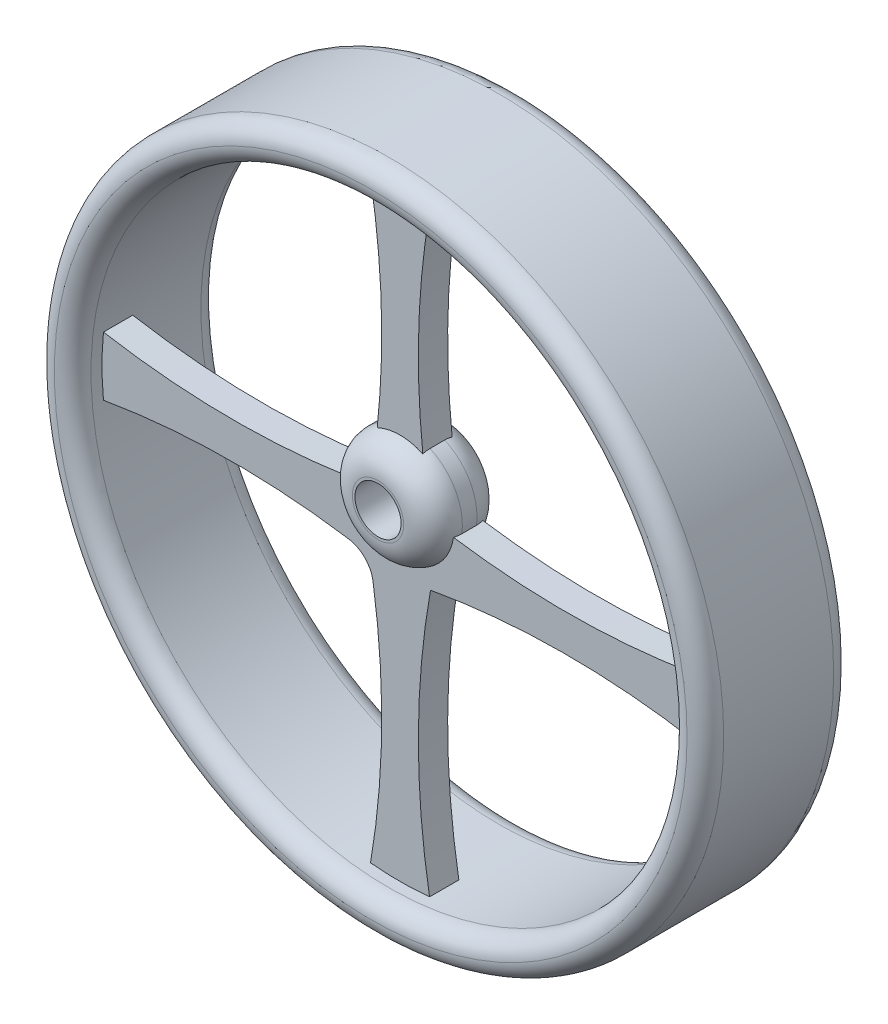
ISO-10303-21;
HEADER;
FILE_DESCRIPTION(('STEP AP214'),'2;1');
FILE_NAME('part.step','',(''),(''),'','','');
FILE_SCHEMA(('AUTOMOTIVE_DESIGN { 1 0 10303 214 1 1 1 1 }'));
ENDSEC;
DATA;
#1=APPLICATION_CONTEXT('core data for automotive mechanical design processes');
#2=APPLICATION_PROTOCOL_DEFINITION('international standard','automotive_design',2000,#1);
#3=PRODUCT_CONTEXT('',#1,'mechanical');
#4=PRODUCT('Part','Part','',(#3));
#5=PRODUCT_RELATED_PRODUCT_CATEGORY('part','',(#4));
#6=PRODUCT_DEFINITION_FORMATION('','',#4);
#7=PRODUCT_DEFINITION_CONTEXT('part definition',#1,'design');
#8=PRODUCT_DEFINITION('design','',#6,#7);
#9=PRODUCT_DEFINITION_SHAPE('','',#8);
#10=(LENGTH_UNIT() NAMED_UNIT(*) SI_UNIT(.MILLI.,.METRE.));
#11=(NAMED_UNIT(*) PLANE_ANGLE_UNIT() SI_UNIT($,.RADIAN.));
#12=(NAMED_UNIT(*) SI_UNIT($,.STERADIAN.) SOLID_ANGLE_UNIT());
#13=UNCERTAINTY_MEASURE_WITH_UNIT(LENGTH_MEASURE(1.E-05),#10,'distance_accuracy_value','');
#14=(GEOMETRIC_REPRESENTATION_CONTEXT(3) GLOBAL_UNCERTAINTY_ASSIGNED_CONTEXT((#13)) GLOBAL_UNIT_ASSIGNED_CONTEXT((#10,
#11,#12)) REPRESENTATION_CONTEXT('',''));
#15=CARTESIAN_POINT('',(0.,0.,0.));
#16=DIRECTION('',(0.,0.,1.));
#17=DIRECTION('',(1.,0.,0.));
#18=AXIS2_PLACEMENT_3D('',#15,#16,#17);
#19=CARTESIAN_POINT('',(0.,3.,3.175));
#20=DIRECTION('',(0.,0.,-1.));
#21=DIRECTION('',(-1.,0.,0.));
#22=AXIS2_PLACEMENT_3D('',#19,#20,#21);
#23=CYLINDRICAL_SURFACE('',#22,4.7625);
#24=DIRECTION('',(0.,0.,-1.));
#25=VECTOR('',#24,1.);
#26=CARTESIAN_POINT('',(4.71107858393852,2.30204238957098,0.));
#27=LINE('',#26,#25);
#28=CARTESIAN_POINT('',(4.71107858393852,2.30204238957098,-0.635));
#29=VERTEX_POINT('',#28);
#30=CARTESIAN_POINT('',(4.71107858393852,2.30204238957098,0.635));
#31=VERTEX_POINT('',#30);
#32=EDGE_CURVE('E269',#29,#31,#27,.F.);
#33=ORIENTED_EDGE('',*,*,#32,.F.);
#34=CARTESIAN_POINT('',(0.,3.,-0.635));
#35=DIRECTION('',(0.,0.,1.));
#36=DIRECTION('',(1.,0.,0.));
#37=AXIS2_PLACEMENT_3D('',#34,#35,#36);
#38=CIRCLE('',#37,4.7625);
#39=CARTESIAN_POINT('',(1.96656615664382,7.337513550589,-0.635));
#40=VERTEX_POINT('',#39);
#41=EDGE_CURVE('E305',#29,#40,#38,.T.);
#42=ORIENTED_EDGE('',*,*,#41,.T.);
#43=DIRECTION('',(0.,0.,-1.));
#44=VECTOR('',#43,1.);
#45=CARTESIAN_POINT('',(1.96656615664382,7.337513550589,0.));
#46=LINE('',#45,#44);
#47=CARTESIAN_POINT('',(1.96656615664382,7.337513550589,0.635));
#48=VERTEX_POINT('',#47);
#49=EDGE_CURVE('E250',#40,#48,#46,.F.);
#50=ORIENTED_EDGE('',*,*,#49,.T.);
#51=CARTESIAN_POINT('',(0.,3.,0.635));
#52=DIRECTION('',(0.,0.,1.));
#53=DIRECTION('',(1.,0.,0.));
#54=AXIS2_PLACEMENT_3D('',#51,#52,#53);
#55=CIRCLE('',#54,4.7625);
#56=EDGE_CURVE('E300',#48,#31,#55,.F.);
#57=ORIENTED_EDGE('',*,*,#56,.T.);
#58=EDGE_LOOP('',(#33,#42,#50,#57));
#59=FACE_BOUND('',#58,.T.);
#60=ADVANCED_FACE('F36',(#59),#23,.T.);
#61=CARTESIAN_POINT('',(0.,0.,-8.89));
#62=DIRECTION('',(0.,0.,1.));
#63=DIRECTION('',(1.,0.,0.));
#64=AXIS2_PLACEMENT_3D('',#61,#62,#63);
#65=CYLINDRICAL_SURFACE('',#64,25.824999992);
#66=CARTESIAN_POINT('',(0.,0.,-7.3025));
#67=DIRECTION('',(0.,0.,1.));
#68=DIRECTION('',(1.,0.,0.));
#69=AXIS2_PLACEMENT_3D('',#66,#67,#68);
#70=CIRCLE('',#69,25.824999992);
#71=CARTESIAN_POINT('',(25.824999992,0.,-7.3025));
#72=VERTEX_POINT('',#71);
#73=EDGE_CURVE('E278',#72,#72,#70,.F.);
#74=ORIENTED_EDGE('',*,*,#73,.T.);
#75=EDGE_LOOP('',(#74));
#76=FACE_BOUND('',#75,.T.);
#77=CARTESIAN_POINT('',(0.,0.,2.2225));
#78=DIRECTION('',(0.,0.,1.));
#79=DIRECTION('',(1.,0.,0.));
#80=AXIS2_PLACEMENT_3D('',#77,#78,#79);
#81=CIRCLE('',#80,25.824999992);
#82=CARTESIAN_POINT('',(25.824999992,0.,2.2225));
#83=VERTEX_POINT('',#82);
#84=EDGE_CURVE('E275',#83,#83,#81,.T.);
#85=ORIENTED_EDGE('',*,*,#84,.T.);
#86=EDGE_LOOP('',(#85));
#87=FACE_BOUND('',#86,.T.);
#88=DIRECTION('',(0.,0.,-1.));
#89=VECTOR('',#88,1.);
#90=CARTESIAN_POINT('',(-2.5562137763234,-25.6981788404652,0.));
#91=LINE('',#90,#89);
#92=CARTESIAN_POINT('',(-2.5562137763234,-25.6981788404652,-1.27));
#93=VERTEX_POINT('',#92);
#94=CARTESIAN_POINT('',(-2.5562137763234,-25.6981788404652,1.27));
#95=VERTEX_POINT('',#94);
#96=EDGE_CURVE('E241',#93,#95,#91,.F.);
#97=ORIENTED_EDGE('',*,*,#96,.F.);
#98=CARTESIAN_POINT('',(0.,0.,-1.27));
#99=DIRECTION('',(0.,0.,-1.));
#100=DIRECTION('',(-1.,0.,0.));
#101=AXIS2_PLACEMENT_3D('',#98,#99,#100);
#102=CIRCLE('',#101,25.824999992);
#103=CARTESIAN_POINT('',(2.5562137763234,-25.6981788404652,-1.27));
#104=VERTEX_POINT('',#103);
#105=EDGE_CURVE('E231',#93,#104,#102,.F.);
#106=ORIENTED_EDGE('',*,*,#105,.T.);
#107=DIRECTION('',(0.,0.,-1.));
#108=VECTOR('',#107,1.);
#109=CARTESIAN_POINT('',(2.5562137763234,-25.6981788404652,0.));
#110=LINE('',#109,#108);
#111=CARTESIAN_POINT('',(2.5562137763234,-25.6981788404652,1.27));
#112=VERTEX_POINT('',#111);
#113=EDGE_CURVE('E179',#112,#104,#110,.T.);
#114=ORIENTED_EDGE('',*,*,#113,.F.);
#115=CARTESIAN_POINT('',(0.,0.,1.27));
#116=DIRECTION('',(0.,0.,-1.));
#117=DIRECTION('',(-1.,0.,0.));
#118=AXIS2_PLACEMENT_3D('',#115,#116,#117);
#119=CIRCLE('',#118,25.824999992);
#120=EDGE_CURVE('E235',#95,#112,#119,.F.);
#121=ORIENTED_EDGE('',*,*,#120,.F.);
#122=EDGE_LOOP('',(#97,#106,#114,#121));
#123=FACE_BOUND('',#122,.T.);
#124=CARTESIAN_POINT('',(0.,0.,1.27));
#125=DIRECTION('',(0.,0.,-1.));
#126=DIRECTION('',(-1.,0.,0.));
#127=AXIS2_PLACEMENT_3D('',#124,#125,#126);
#128=CIRCLE('',#127,25.824999992);
#129=CARTESIAN_POINT('',(2.5562137763234,25.6981788404652,1.27));
#130=VERTEX_POINT('',#129);
#131=CARTESIAN_POINT('',(-2.5562137763234,25.6981788404652,1.27));
#132=VERTEX_POINT('',#131);
#133=EDGE_CURVE('E267',#130,#132,#128,.F.);
#134=ORIENTED_EDGE('',*,*,#133,.F.);
#135=DIRECTION('',(0.,0.,-1.));
#136=VECTOR('',#135,1.);
#137=CARTESIAN_POINT('',(2.5562137763234,25.6981788404652,0.));
#138=LINE('',#137,#136);
#139=CARTESIAN_POINT('',(2.5562137763234,25.6981788404652,-1.27));
#140=VERTEX_POINT('',#139);
#141=EDGE_CURVE('E265',#140,#130,#138,.F.);
#142=ORIENTED_EDGE('',*,*,#141,.F.);
#143=CARTESIAN_POINT('',(0.,0.,-1.27));
#144=DIRECTION('',(0.,0.,-1.));
#145=DIRECTION('',(-1.,0.,0.));
#146=AXIS2_PLACEMENT_3D('',#143,#144,#145);
#147=CIRCLE('',#146,25.824999992);
#148=CARTESIAN_POINT('',(-2.5562137763234,25.6981788404652,-1.27));
#149=VERTEX_POINT('',#148);
#150=EDGE_CURVE('E257',#140,#149,#147,.F.);
#151=ORIENTED_EDGE('',*,*,#150,.T.);
#152=DIRECTION('',(0.,0.,-1.));
#153=VECTOR('',#152,1.);
#154=CARTESIAN_POINT('',(-2.5562137763234,25.6981788404652,0.));
#155=LINE('',#154,#153);
#156=EDGE_CURVE('E262',#132,#149,#155,.T.);
#157=ORIENTED_EDGE('',*,*,#156,.F.);
#158=EDGE_LOOP('',(#134,#142,#151,#157));
#159=FACE_BOUND('',#158,.T.);
#160=DIRECTION('',(0.,0.,-1.));
#161=VECTOR('',#160,1.);
#162=CARTESIAN_POINT('',(25.6981788404652,-2.55621377632312,0.));
#163=LINE('',#162,#161);
#164=CARTESIAN_POINT('',(25.6981788404652,-2.55621377632313,-1.27));
#165=VERTEX_POINT('',#164);
#166=CARTESIAN_POINT('',(25.6981788404652,-2.55621377632313,1.27));
#167=VERTEX_POINT('',#166);
#168=EDGE_CURVE('E238',#165,#167,#163,.F.);
#169=ORIENTED_EDGE('',*,*,#168,.F.);
#170=CARTESIAN_POINT('',(25.6981788404652,2.55621377632367,-1.27));
#171=VERTEX_POINT('',#170);
#172=EDGE_CURVE('E198',#165,#171,#102,.F.);
#173=ORIENTED_EDGE('',*,*,#172,.T.);
#174=DIRECTION('',(0.,0.,-1.));
#175=VECTOR('',#174,1.);
#176=CARTESIAN_POINT('',(25.6981788404652,2.55621377632367,0.));
#177=LINE('',#176,#175);
#178=CARTESIAN_POINT('',(25.6981788404652,2.55621377632367,1.27));
#179=VERTEX_POINT('',#178);
#180=EDGE_CURVE('E221',#179,#171,#177,.T.);
#181=ORIENTED_EDGE('',*,*,#180,.F.);
#182=EDGE_CURVE('E234',#167,#179,#119,.F.);
#183=ORIENTED_EDGE('',*,*,#182,.F.);
#184=EDGE_LOOP('',(#169,#173,#181,#183));
#185=FACE_BOUND('',#184,.T.);
#186=CARTESIAN_POINT('',(-25.6981788404652,2.5562137763233,1.27));
#187=VERTEX_POINT('',#186);
#188=CARTESIAN_POINT('',(-25.6981788404652,-2.55621377632349,1.27));
#189=VERTEX_POINT('',#188);
#190=EDGE_CURVE('E232',#187,#189,#119,.F.);
#191=ORIENTED_EDGE('',*,*,#190,.F.);
#192=DIRECTION('',(0.,0.,-1.));
#193=VECTOR('',#192,1.);
#194=CARTESIAN_POINT('',(-25.6981788404652,2.5562137763233,0.));
#195=LINE('',#194,#193);
#196=CARTESIAN_POINT('',(-25.6981788404652,2.5562137763233,-1.27));
#197=VERTEX_POINT('',#196);
#198=EDGE_CURVE('E236',#197,#187,#195,.F.);
#199=ORIENTED_EDGE('',*,*,#198,.F.);
#200=CARTESIAN_POINT('',(-25.6981788404652,-2.55621377632349,-1.27));
#201=VERTEX_POINT('',#200);
#202=EDGE_CURVE('E228',#197,#201,#102,.F.);
#203=ORIENTED_EDGE('',*,*,#202,.T.);
#204=DIRECTION('',(0.,0.,-1.));
#205=VECTOR('',#204,1.);
#206=CARTESIAN_POINT('',(-25.6981788404652,-2.55621377632349,0.));
#207=LINE('',#206,#205);
#208=EDGE_CURVE('E244',#189,#201,#207,.T.);
#209=ORIENTED_EDGE('',*,*,#208,.F.);
#210=EDGE_LOOP('',(#191,#199,#203,#209));
#211=FACE_BOUND('',#210,.T.);
#212=ADVANCED_FACE('F400',(#76,#87,#123,#159,#185,#211),#65,.F.);
#213=DIRECTION('',(0.,0.,-1.));
#214=VECTOR('',#213,1.);
#215=CARTESIAN_POINT('',(-1.96656615664382,7.33751355058899,0.));
#216=LINE('',#215,#214);
#217=CARTESIAN_POINT('',(-1.96656615664382,7.33751355058899,0.635));
#218=VERTEX_POINT('',#217);
#219=CARTESIAN_POINT('',(-1.96656615664382,7.33751355058899,-0.635));
#220=VERTEX_POINT('',#219);
#221=EDGE_CURVE('E247',#218,#220,#216,.T.);
#222=ORIENTED_EDGE('',*,*,#221,.T.);
#223=CARTESIAN_POINT('',(0.,3.,-0.635));
#224=DIRECTION('',(0.,0.,1.));
#225=DIRECTION('',(1.,0.,0.));
#226=AXIS2_PLACEMENT_3D('',#223,#224,#225);
#227=CIRCLE('',#226,4.7625);
#228=CARTESIAN_POINT('',(-4.71107858393851,2.30204238957091,-0.635));
#229=VERTEX_POINT('',#228);
#230=EDGE_CURVE('E303',#220,#229,#227,.T.);
#231=ORIENTED_EDGE('',*,*,#230,.T.);
#232=DIRECTION('',(0.,0.,-1.));
#233=VECTOR('',#232,1.);
#234=CARTESIAN_POINT('',(-4.71107858393851,2.30204238957091,0.));
#235=LINE('',#234,#233);
#236=CARTESIAN_POINT('',(-4.71107858393851,2.30204238957091,0.635));
#237=VERTEX_POINT('',#236);
#238=EDGE_CURVE('E272',#237,#229,#235,.T.);
#239=ORIENTED_EDGE('',*,*,#238,.F.);
#240=CARTESIAN_POINT('',(0.,3.,0.635));
#241=DIRECTION('',(0.,0.,1.));
#242=DIRECTION('',(1.,0.,0.));
#243=AXIS2_PLACEMENT_3D('',#240,#241,#242);
#244=CIRCLE('',#243,4.7625);
#245=EDGE_CURVE('E298',#237,#218,#244,.F.);
#246=ORIENTED_EDGE('',*,*,#245,.T.);
#247=EDGE_LOOP('',(#222,#231,#239,#246));
#248=FACE_BOUND('',#247,.T.);
#249=ADVANCED_FACE('F398',(#248),#23,.T.);
#250=CARTESIAN_POINT('',(67.8079724044094,14.4128360718493,1.27));
#251=DIRECTION('',(0.,0.,-1.));
#252=DIRECTION('',(-1.,0.,0.));
#253=AXIS2_PLACEMENT_3D('',#250,#251,#252);
#254=CYLINDRICAL_SURFACE('',#253,66.2204724044094);
#255=ORIENTED_EDGE('',*,*,#49,.F.);
#256=CARTESIAN_POINT('',(1.96656615664382,7.337513550589,-0.635));
#257=CARTESIAN_POINT('',(1.96656604131507,7.33752103080129,-0.688836671156674));
#258=CARTESIAN_POINT('',(1.96677841304455,7.33553987882745,-0.742661949557122));
#259=CARTESIAN_POINT('',(1.96762484897395,7.32766505895606,-0.849733116260245));
#260=CARTESIAN_POINT('',(1.96825665308089,7.32179236079308,-0.902980563668016));
#261=CARTESIAN_POINT('',(1.97078310963382,7.29836984310736,-1.06210365472474));
#262=CARTESIAN_POINT('',(1.97330879305827,7.27501596953603,-1.16714274710446));
#263=CARTESIAN_POINT('',(1.97667071605037,7.24410651359392,-1.27));
#264=B_SPLINE_CURVE_WITH_KNOTS('',3,(#256,#257,#258,#259,#260,#261,#262,#263),.UNSPECIFIED.,.F.,
.F.,(4,2,2,4),(0.,0.161450883355719,0.322038781475506,0.643859831909047),.UNSPECIFIED.);
#265=CARTESIAN_POINT('',(1.97667071605036,7.24410651359393,-1.27));
#266=VERTEX_POINT('',#265);
#267=EDGE_CURVE('E318',#40,#266,#264,.T.);
#268=ORIENTED_EDGE('',*,*,#267,.T.);
#269=CARTESIAN_POINT('',(67.8079724044094,14.4128360718493,-1.27));
#270=DIRECTION('',(0.,0.,-1.));
#271=DIRECTION('',(-1.,0.,0.));
#272=AXIS2_PLACEMENT_3D('',#269,#270,#271);
#273=CIRCLE('',#272,66.2204724044094);
#274=EDGE_CURVE('E253',#266,#140,#273,.T.);
#275=ORIENTED_EDGE('',*,*,#274,.T.);
#276=ORIENTED_EDGE('',*,*,#141,.T.);
#277=CARTESIAN_POINT('',(67.8079724044094,14.4128360718493,1.27));
#278=DIRECTION('',(0.,0.,-1.));
#279=DIRECTION('',(-1.,0.,0.));
#280=AXIS2_PLACEMENT_3D('',#277,#278,#279);
#281=CIRCLE('',#280,66.2204724044094);
#282=CARTESIAN_POINT('',(1.97667071605036,7.24410651359392,1.27));
#283=VERTEX_POINT('',#282);
#284=EDGE_CURVE('E56',#283,#130,#281,.T.);
#285=ORIENTED_EDGE('',*,*,#284,.F.);
#286=CARTESIAN_POINT('',(1.97667071605036,7.24410651359392,1.27));
#287=CARTESIAN_POINT('',(1.97330879305831,7.27501596953601,1.16714274710446));
#288=CARTESIAN_POINT('',(1.97078310963384,7.29836984310735,1.06210365472473));
#289=CARTESIAN_POINT('',(1.96825665308089,7.32179236079308,0.902980563668011));
#290=CARTESIAN_POINT('',(1.96762484897395,7.32766505895606,0.849733116260239));
#291=CARTESIAN_POINT('',(1.96677841304457,7.33553987882744,0.742661949557113));
#292=CARTESIAN_POINT('',(1.96656604131511,7.33752103080128,0.688836671156663));
#293=CARTESIAN_POINT('',(1.9665661566439,7.33751355058896,0.634999999999986));
#294=B_SPLINE_CURVE_WITH_KNOTS('',3,(#286,#287,#288,#289,#290,#291,#292,#293),.UNSPECIFIED.,.F.,
.F.,(4,2,2,4),(0.,0.321821050433543,0.482408948553334,0.643859831909057),.UNSPECIFIED.);
#295=EDGE_CURVE('E11',#283,#48,#294,.T.);
#296=ORIENTED_EDGE('',*,*,#295,.T.);
#297=EDGE_LOOP('',(#255,#268,#275,#276,#285,#296));
#298=FACE_BOUND('',#297,.T.);
#299=ADVANCED_FACE('F327',(#298),#254,.F.);
#300=CARTESIAN_POINT('',(-67.8079724044094,14.4128360718493,1.27));
#301=DIRECTION('',(0.,0.,-1.));
#302=DIRECTION('',(-1.,0.,0.));
#303=AXIS2_PLACEMENT_3D('',#300,#301,#302);
#304=CYLINDRICAL_SURFACE('',#303,66.2204724044094);
#305=ORIENTED_EDGE('',*,*,#221,.F.);
#306=CARTESIAN_POINT('',(-1.96656615664382,7.33751355058899,0.635));
#307=CARTESIAN_POINT('',(-1.96656604131508,7.33752103080129,0.688836671156673));
#308=CARTESIAN_POINT('',(-1.96677841304456,7.33553987882745,0.742661949557121));
#309=CARTESIAN_POINT('',(-1.96762484897395,7.32766505895606,0.849733116260245));
#310=CARTESIAN_POINT('',(-1.96825665308088,7.32179236079308,0.902980563668017));
#311=CARTESIAN_POINT('',(-1.97078310963378,7.29836984310738,1.06210365472474));
#312=CARTESIAN_POINT('',(-1.97330879305822,7.27501596953605,1.16714274710446));
#313=CARTESIAN_POINT('',(-1.97667071605035,7.24410651359393,1.27));
#314=B_SPLINE_CURVE_WITH_KNOTS('',3,(#306,#307,#308,#309,#310,#311,#312,#313),.UNSPECIFIED.,.F.,
.F.,(4,2,2,4),(0.,0.161450883355719,0.322038781475506,0.643859831909047),.UNSPECIFIED.);
#315=CARTESIAN_POINT('',(-1.97667071605036,7.24410651359392,1.27));
#316=VERTEX_POINT('',#315);
#317=EDGE_CURVE('E377',#218,#316,#314,.T.);
#318=ORIENTED_EDGE('',*,*,#317,.T.);
#319=CARTESIAN_POINT('',(-67.8079724044094,14.4128360718493,1.27));
#320=DIRECTION('',(0.,0.,-1.));
#321=DIRECTION('',(-1.,0.,0.));
#322=AXIS2_PLACEMENT_3D('',#319,#320,#321);
#323=CIRCLE('',#322,66.2204724044094);
#324=EDGE_CURVE('E63',#132,#316,#323,.T.);
#325=ORIENTED_EDGE('',*,*,#324,.F.);
#326=ORIENTED_EDGE('',*,*,#156,.T.);
#327=CARTESIAN_POINT('',(-67.8079724044094,14.4128360718493,-1.27));
#328=DIRECTION('',(0.,0.,-1.));
#329=DIRECTION('',(-1.,0.,0.));
#330=AXIS2_PLACEMENT_3D('',#327,#328,#329);
#331=CIRCLE('',#330,66.2204724044094);
#332=CARTESIAN_POINT('',(-1.97667071605036,7.24410651359392,-1.27));
#333=VERTEX_POINT('',#332);
#334=EDGE_CURVE('E255',#149,#333,#331,.T.);
#335=ORIENTED_EDGE('',*,*,#334,.T.);
#336=CARTESIAN_POINT('',(-1.97667071605036,7.24410651359392,-1.27));
#337=CARTESIAN_POINT('',(-1.97330879305827,7.27501596953603,-1.16714274710446));
#338=CARTESIAN_POINT('',(-1.97078310963381,7.29836984310736,-1.06210365472474));
#339=CARTESIAN_POINT('',(-1.96825665308088,7.32179236079308,-0.902980563668013));
#340=CARTESIAN_POINT('',(-1.96762484897394,7.32766505895606,-0.849733116260241));
#341=CARTESIAN_POINT('',(-1.96677841304457,7.33553987882745,-0.742661949557115));
#342=CARTESIAN_POINT('',(-1.96656604131511,7.33752103080128,-0.688836671156665));
#343=CARTESIAN_POINT('',(-1.96656615664389,7.33751355058896,-0.634999999999989));
#344=B_SPLINE_CURVE_WITH_KNOTS('',3,(#336,#337,#338,#339,#340,#341,#342,#343),.UNSPECIFIED.,.F.,
.F.,(4,2,2,4),(0.,0.321821050433544,0.482408948553334,0.643859831909057),.UNSPECIFIED.);
#345=EDGE_CURVE('E342',#333,#220,#344,.T.);
#346=ORIENTED_EDGE('',*,*,#345,.T.);
#347=EDGE_LOOP('',(#305,#318,#325,#326,#335,#346));
#348=FACE_BOUND('',#347,.T.);
#349=ADVANCED_FACE('F384',(#348),#304,.F.);
#350=CARTESIAN_POINT('',(0.,0.,-8.89));
#351=DIRECTION('',(0.,0.,1.));
#352=DIRECTION('',(1.,0.,0.));
#353=AXIS2_PLACEMENT_3D('',#350,#351,#352);
#354=CYLINDRICAL_SURFACE('',#353,28.999999992);
#355=CARTESIAN_POINT('',(0.,0.,-7.3025));
#356=DIRECTION('',(0.,0.,1.));
#357=DIRECTION('',(1.,0.,0.));
#358=AXIS2_PLACEMENT_3D('',#355,#356,#357);
#359=CIRCLE('',#358,28.999999992);
#360=CARTESIAN_POINT('',(28.999999992,0.,-7.3025));
#361=VERTEX_POINT('',#360);
#362=EDGE_CURVE('E284',#361,#361,#359,.T.);
#363=ORIENTED_EDGE('',*,*,#362,.T.);
#364=EDGE_LOOP('',(#363));
#365=FACE_BOUND('',#364,.T.);
#366=CARTESIAN_POINT('',(0.,0.,2.2225));
#367=DIRECTION('',(0.,0.,1.));
#368=DIRECTION('',(1.,0.,0.));
#369=AXIS2_PLACEMENT_3D('',#366,#367,#368);
#370=CIRCLE('',#369,28.999999992);
#371=CARTESIAN_POINT('',(28.999999992,0.,2.2225));
#372=VERTEX_POINT('',#371);
#373=EDGE_CURVE('E281',#372,#372,#370,.F.);
#374=ORIENTED_EDGE('',*,*,#373,.T.);
#375=EDGE_LOOP('',(#374));
#376=FACE_BOUND('',#375,.T.);
#377=ADVANCED_FACE('F388',(#365,#376),#354,.T.);
#378=CARTESIAN_POINT('',(67.8079724044094,14.4128360718493,1.27));
#379=DIRECTION('',(0.,0.,-1.));
#380=DIRECTION('',(-1.,0.,0.));
#381=AXIS2_PLACEMENT_3D('',#378,#379,#380);
#382=PLANE('',#381);
#383=ORIENTED_EDGE('',*,*,#324,.T.);
#384=CARTESIAN_POINT('',(0.,3.,1.27));
#385=DIRECTION('',(0.,0.,1.));
#386=DIRECTION('',(1.,0.,0.));
#387=AXIS2_PLACEMENT_3D('',#384,#385,#386);
#388=CIRCLE('',#387,4.68184442484171);
#389=EDGE_CURVE('E50',#316,#283,#388,.F.);
#390=ORIENTED_EDGE('',*,*,#389,.T.);
#391=ORIENTED_EDGE('',*,*,#284,.T.);
#392=ORIENTED_EDGE('',*,*,#133,.T.);
#393=EDGE_LOOP('',(#383,#390,#391,#392));
#394=FACE_BOUND('',#393,.T.);
#395=ADVANCED_FACE('F394',(#394),#382,.F.);
#396=CARTESIAN_POINT('',(67.8079724044094,14.4128360718493,-1.27));
#397=DIRECTION('',(0.,0.,-1.));
#398=DIRECTION('',(-1.,0.,0.));
#399=AXIS2_PLACEMENT_3D('',#396,#397,#398);
#400=PLANE('',#399);
#401=ORIENTED_EDGE('',*,*,#274,.F.);
#402=CARTESIAN_POINT('',(0.,3.,-1.27));
#403=DIRECTION('',(0.,0.,1.));
#404=DIRECTION('',(1.,0.,0.));
#405=AXIS2_PLACEMENT_3D('',#402,#403,#404);
#406=CIRCLE('',#405,4.68184442484171);
#407=EDGE_CURVE('E325',#266,#333,#406,.T.);
#408=ORIENTED_EDGE('',*,*,#407,.T.);
#409=ORIENTED_EDGE('',*,*,#334,.F.);
#410=ORIENTED_EDGE('',*,*,#150,.F.);
#411=EDGE_LOOP('',(#401,#408,#409,#410));
#412=FACE_BOUND('',#411,.T.);
#413=ADVANCED_FACE('F390',(#412),#400,.T.);
#414=CARTESIAN_POINT('',(0.,3.,3.175));
#415=DIRECTION('',(0.,0.,1.));
#416=DIRECTION('',(1.,0.,0.));
#417=AXIS2_PLACEMENT_3D('',#414,#415,#416);
#418=PLANE('',#417);
#419=CARTESIAN_POINT('',(0.,3.,3.175));
#420=DIRECTION('',(0.,0.,1.));
#421=DIRECTION('',(1.,0.,0.));
#422=AXIS2_PLACEMENT_3D('',#419,#420,#421);
#423=CIRCLE('',#422,2.2225);
#424=CARTESIAN_POINT('',(2.2225,3.,3.175));
#425=VERTEX_POINT('',#424);
#426=EDGE_CURVE('E311',#425,#425,#423,.T.);
#427=ORIENTED_EDGE('',*,*,#426,.T.);
#428=EDGE_LOOP('',(#427));
#429=FACE_BOUND('',#428,.T.);
#430=CARTESIAN_POINT('',(0.,3.,3.175));
#431=DIRECTION('',(0.,0.,1.));
#432=DIRECTION('',(1.,0.,0.));
#433=AXIS2_PLACEMENT_3D('',#430,#431,#432);
#434=CIRCLE('',#433,2.);
#435=CARTESIAN_POINT('',(2.,3.,3.175));
#436=VERTEX_POINT('',#435);
#437=EDGE_CURVE('E204',#436,#436,#434,.T.);
#438=ORIENTED_EDGE('',*,*,#437,.F.);
#439=EDGE_LOOP('',(#438));
#440=FACE_BOUND('',#439,.T.);
#441=ADVANCED_FACE('F366',(#429,#440),#418,.T.);
#442=CARTESIAN_POINT('',(0.,3.,-3.175));
#443=DIRECTION('',(0.,0.,1.));
#444=DIRECTION('',(1.,0.,0.));
#445=AXIS2_PLACEMENT_3D('',#442,#443,#444);
#446=PLANE('',#445);
#447=CARTESIAN_POINT('',(0.,3.,-3.175));
#448=DIRECTION('',(0.,0.,1.));
#449=DIRECTION('',(1.,0.,0.));
#450=AXIS2_PLACEMENT_3D('',#447,#448,#449);
#451=CIRCLE('',#450,2.2225);
#452=CARTESIAN_POINT('',(2.2225,3.,-3.175));
#453=VERTEX_POINT('',#452);
#454=EDGE_CURVE('E308',#453,#453,#451,.F.);
#455=ORIENTED_EDGE('',*,*,#454,.T.);
#456=EDGE_LOOP('',(#455));
#457=FACE_BOUND('',#456,.T.);
#458=CARTESIAN_POINT('',(0.,3.,-3.175));
#459=DIRECTION('',(0.,0.,1.));
#460=DIRECTION('',(1.,0.,0.));
#461=AXIS2_PLACEMENT_3D('',#458,#459,#460);
#462=CIRCLE('',#461,2.);
#463=CARTESIAN_POINT('',(2.,3.,-3.175));
#464=VERTEX_POINT('',#463);
#465=EDGE_CURVE('E200',#464,#464,#462,.T.);
#466=ORIENTED_EDGE('',*,*,#465,.T.);
#467=EDGE_LOOP('',(#466));
#468=FACE_BOUND('',#467,.T.);
#469=ADVANCED_FACE('F402',(#457,#468),#446,.F.);
#470=CARTESIAN_POINT('',(-14.412836071849,-67.8079724044095,1.27));
#471=DIRECTION('',(0.,0.,-1.));
#472=DIRECTION('',(-1.,0.,0.));
#473=AXIS2_PLACEMENT_3D('',#470,#471,#472);
#474=CYLINDRICAL_SURFACE('',#473,66.2204724044094);
#475=CARTESIAN_POINT('',(-14.412836071849,-67.8079724044095,-1.27));
#476=DIRECTION('',(0.,0.,-1.));
#477=DIRECTION('',(0.,-1.,0.));
#478=AXIS2_PLACEMENT_3D('',#475,#476,#477);
#479=CIRCLE('',#478,66.2204724044094);
#480=CARTESIAN_POINT('',(-4.46822330042555,-2.3384707850326,-1.27));
#481=VERTEX_POINT('',#480);
#482=EDGE_CURVE('E218',#201,#481,#479,.T.);
#483=ORIENTED_EDGE('',*,*,#482,.T.);
#484=DIRECTION('',(0.,0.,-1.));
#485=VECTOR('',#484,1.);
#486=CARTESIAN_POINT('',(-4.46822330042555,-2.33847078503259,1.27));
#487=LINE('',#486,#485);
#488=CARTESIAN_POINT('',(-4.46822330042555,-2.3384707850326,1.27));
#489=VERTEX_POINT('',#488);
#490=EDGE_CURVE('E296',#481,#489,#487,.F.);
#491=ORIENTED_EDGE('',*,*,#490,.T.);
#492=CARTESIAN_POINT('',(-14.412836071849,-67.8079724044095,1.27));
#493=DIRECTION('',(0.,0.,-1.));
#494=DIRECTION('',(0.,-1.,0.));
#495=AXIS2_PLACEMENT_3D('',#492,#493,#494);
#496=CIRCLE('',#495,66.2204724044094);
#497=EDGE_CURVE('E217',#189,#489,#496,.T.);
#498=ORIENTED_EDGE('',*,*,#497,.F.);
#499=ORIENTED_EDGE('',*,*,#208,.T.);
#500=EDGE_LOOP('',(#483,#491,#498,#499));
#501=FACE_BOUND('',#500,.T.);
#502=ADVANCED_FACE('F364',(#501),#474,.F.);
#503=CARTESIAN_POINT('',(-67.8079724044094,-14.4128360718493,1.27));
#504=DIRECTION('',(0.,0.,-1.));
#505=DIRECTION('',(-1.,0.,0.));
#506=AXIS2_PLACEMENT_3D('',#503,#504,#505);
#507=CYLINDRICAL_SURFACE('',#506,66.2204724044094);
#508=CARTESIAN_POINT('',(-67.8079724044094,-14.4128360718493,1.27));
#509=DIRECTION('',(0.,0.,-1.));
#510=DIRECTION('',(1.,0.,0.));
#511=AXIS2_PLACEMENT_3D('',#508,#509,#510);
#512=CIRCLE('',#511,66.2204724044094);
#513=CARTESIAN_POINT('',(-2.33847078503258,-4.46822330042556,1.27));
#514=VERTEX_POINT('',#513);
#515=EDGE_CURVE('E183',#514,#95,#512,.T.);
#516=ORIENTED_EDGE('',*,*,#515,.F.);
#517=DIRECTION('',(0.,0.,-1.));
#518=VECTOR('',#517,1.);
#519=CARTESIAN_POINT('',(-2.33847078503258,-4.46822330042557,1.27));
#520=LINE('',#519,#518);
#521=CARTESIAN_POINT('',(-2.33847078503258,-4.46822330042556,-1.27));
#522=VERTEX_POINT('',#521);
#523=EDGE_CURVE('E287',#514,#522,#520,.T.);
#524=ORIENTED_EDGE('',*,*,#523,.T.);
#525=CARTESIAN_POINT('',(-67.8079724044094,-14.4128360718493,-1.27));
#526=DIRECTION('',(0.,0.,-1.));
#527=DIRECTION('',(1.,0.,0.));
#528=AXIS2_PLACEMENT_3D('',#525,#526,#527);
#529=CIRCLE('',#528,66.2204724044094);
#530=EDGE_CURVE('E184',#522,#93,#529,.T.);
#531=ORIENTED_EDGE('',*,*,#530,.T.);
#532=ORIENTED_EDGE('',*,*,#96,.T.);
#533=EDGE_LOOP('',(#516,#524,#531,#532));
#534=FACE_BOUND('',#533,.T.);
#535=ADVANCED_FACE('F409',(#534),#507,.F.);
#536=CARTESIAN_POINT('',(67.8079724044094,-14.4128360718493,1.27));
#537=DIRECTION('',(0.,0.,-1.));
#538=DIRECTION('',(-1.,0.,0.));
#539=AXIS2_PLACEMENT_3D('',#536,#537,#538);
#540=CYLINDRICAL_SURFACE('',#539,66.2204724044094);
#541=CARTESIAN_POINT('',(67.8079724044094,-14.4128360718493,1.27));
#542=DIRECTION('',(0.,0.,-1.));
#543=DIRECTION('',(1.,0.,0.));
#544=AXIS2_PLACEMENT_3D('',#541,#542,#543);
#545=CIRCLE('',#544,66.2204724044094);
#546=CARTESIAN_POINT('',(2.64203623611498,-2.64203623611494,1.27));
#547=VERTEX_POINT('',#546);
#548=EDGE_CURVE('E210',#112,#547,#545,.T.);
#549=ORIENTED_EDGE('',*,*,#548,.F.);
#550=ORIENTED_EDGE('',*,*,#113,.T.);
#551=CARTESIAN_POINT('',(67.8079724044094,-14.4128360718493,-1.27));
#552=DIRECTION('',(0.,0.,-1.));
#553=DIRECTION('',(1.,0.,0.));
#554=AXIS2_PLACEMENT_3D('',#551,#552,#553);
#555=CIRCLE('',#554,66.2204724044094);
#556=CARTESIAN_POINT('',(2.64203623611498,-2.64203623611494,-1.27));
#557=VERTEX_POINT('',#556);
#558=EDGE_CURVE('E173',#104,#557,#555,.T.);
#559=ORIENTED_EDGE('',*,*,#558,.T.);
#560=DIRECTION('',(0.,0.,-1.));
#561=VECTOR('',#560,1.);
#562=CARTESIAN_POINT('',(2.64203623611498,-2.64203623611493,0.));
#563=LINE('',#562,#561);
#564=EDGE_CURVE('E177',#547,#557,#563,.T.);
#565=ORIENTED_EDGE('',*,*,#564,.F.);
#566=EDGE_LOOP('',(#549,#550,#559,#565));
#567=FACE_BOUND('',#566,.T.);
#568=ADVANCED_FACE('F176',(#567),#540,.F.);
#569=CARTESIAN_POINT('',(14.41283607185,-67.8079724044093,1.27));
#570=DIRECTION('',(0.,0.,-1.));
#571=DIRECTION('',(-1.,0.,0.));
#572=AXIS2_PLACEMENT_3D('',#569,#570,#571);
#573=CYLINDRICAL_SURFACE('',#572,66.2204724044094);
#574=CARTESIAN_POINT('',(14.41283607185,-67.8079724044093,-1.27));
#575=DIRECTION('',(0.,0.,-1.));
#576=DIRECTION('',(0.,1.,0.));
#577=AXIS2_PLACEMENT_3D('',#574,#575,#576);
#578=CIRCLE('',#577,66.2204724044094);
#579=EDGE_CURVE('E190',#557,#165,#578,.T.);
#580=ORIENTED_EDGE('',*,*,#579,.T.);
#581=ORIENTED_EDGE('',*,*,#168,.T.);
#582=CARTESIAN_POINT('',(14.41283607185,-67.8079724044093,1.27));
#583=DIRECTION('',(0.,0.,-1.));
#584=DIRECTION('',(0.,1.,0.));
#585=AXIS2_PLACEMENT_3D('',#582,#583,#584);
#586=CIRCLE('',#585,66.2204724044094);
#587=EDGE_CURVE('E192',#547,#167,#586,.T.);
#588=ORIENTED_EDGE('',*,*,#587,.F.);
#589=ORIENTED_EDGE('',*,*,#564,.T.);
#590=EDGE_LOOP('',(#580,#581,#588,#589));
#591=FACE_BOUND('',#590,.T.);
#592=ADVANCED_FACE('F188',(#591),#573,.F.);
#593=CARTESIAN_POINT('',(-14.4128360718495,67.8079724044093,1.27));
#594=DIRECTION('',(0.,0.,-1.));
#595=DIRECTION('',(-1.,0.,0.));
#596=AXIS2_PLACEMENT_3D('',#593,#594,#595);
#597=CYLINDRICAL_SURFACE('',#596,66.2204724044094);
#598=CARTESIAN_POINT('',(-14.4128360718495,67.8079724044093,-1.27));
#599=DIRECTION('',(0.,0.,-1.));
#600=DIRECTION('',(0.,-1.,0.));
#601=AXIS2_PLACEMENT_3D('',#598,#599,#600);
#602=CIRCLE('',#601,66.2204724044094);
#603=CARTESIAN_POINT('',(-4.63130050922474,2.31390757789049,-1.27));
#604=VERTEX_POINT('',#603);
#605=EDGE_CURVE('E212',#604,#197,#602,.T.);
#606=ORIENTED_EDGE('',*,*,#605,.T.);
#607=ORIENTED_EDGE('',*,*,#198,.T.);
#608=CARTESIAN_POINT('',(-14.4128360718495,67.8079724044093,1.27));
#609=DIRECTION('',(0.,0.,-1.));
#610=DIRECTION('',(0.,-1.,0.));
#611=AXIS2_PLACEMENT_3D('',#608,#609,#610);
#612=CIRCLE('',#611,66.2204724044094);
#613=CARTESIAN_POINT('',(-4.63130050922474,2.31390757789049,1.27));
#614=VERTEX_POINT('',#613);
#615=EDGE_CURVE('E214',#614,#187,#612,.T.);
#616=ORIENTED_EDGE('',*,*,#615,.F.);
#617=CARTESIAN_POINT('',(-4.63130050922474,2.31390757789048,1.27));
#618=CARTESIAN_POINT('',(-4.65783909852795,2.30995433771547,1.16586726961863));
#619=CARTESIAN_POINT('',(-4.67775656607236,2.30698895193466,1.06088423778076));
#620=CARTESIAN_POINT('',(-4.70434925765321,2.30303388916004,0.849217571115326));
#621=CARTESIAN_POINT('',(-4.71102448168006,2.30204421216766,0.742533936286532));
#622=CARTESIAN_POINT('',(-4.71107858393851,2.30204238957092,0.635));
#623=B_SPLINE_CURVE_WITH_KNOTS('',3,(#617,#618,#619,#620,#621,#622),.UNSPECIFIED.,.F.,.F.,(4,2,
4),(0.,0.32069054242486,0.641381085082064),.UNSPECIFIED.);
#624=EDGE_CURVE('E370',#614,#237,#623,.T.);
#625=ORIENTED_EDGE('',*,*,#624,.T.);
#626=ORIENTED_EDGE('',*,*,#238,.T.);
#627=CARTESIAN_POINT('',(-4.71107858393852,2.30204238957092,-0.635));
#628=CARTESIAN_POINT('',(-4.71102448168006,2.30204421216766,-0.742533936286532));
#629=CARTESIAN_POINT('',(-4.70434925765321,2.30303388916005,-0.849217571115326));
#630=CARTESIAN_POINT('',(-4.67775656607236,2.30698895193466,-1.06088423778076));
#631=CARTESIAN_POINT('',(-4.65783909852795,2.30995433771547,-1.16586726961863));
#632=CARTESIAN_POINT('',(-4.63130050922474,2.31390757789048,-1.27));
#633=B_SPLINE_CURVE_WITH_KNOTS('',3,(#627,#628,#629,#630,#631,#632),.UNSPECIFIED.,.F.,.F.,(4,2,
4),(0.,0.320690542657204,0.641381085082064),.UNSPECIFIED.);
#634=EDGE_CURVE('E348',#229,#604,#633,.T.);
#635=ORIENTED_EDGE('',*,*,#634,.T.);
#636=EDGE_LOOP('',(#606,#607,#616,#625,#626,#635));
#637=FACE_BOUND('',#636,.T.);
#638=ADVANCED_FACE('F357',(#637),#597,.F.);
#639=CARTESIAN_POINT('',(14.4128360718486,67.8079724044096,1.27));
#640=DIRECTION('',(0.,0.,-1.));
#641=DIRECTION('',(-1.,0.,0.));
#642=AXIS2_PLACEMENT_3D('',#639,#640,#641);
#643=CYLINDRICAL_SURFACE('',#642,66.2204724044094);
#644=CARTESIAN_POINT('',(14.4128360718486,67.8079724044096,1.27));
#645=DIRECTION('',(0.,0.,-1.));
#646=DIRECTION('',(0.,1.,0.));
#647=AXIS2_PLACEMENT_3D('',#644,#645,#646);
#648=CIRCLE('',#647,66.2204724044094);
#649=CARTESIAN_POINT('',(4.63130050922474,2.31390757789054,1.27));
#650=VERTEX_POINT('',#649);
#651=EDGE_CURVE('E193',#179,#650,#648,.T.);
#652=ORIENTED_EDGE('',*,*,#651,.F.);
#653=ORIENTED_EDGE('',*,*,#180,.T.);
#654=CARTESIAN_POINT('',(14.4128360718486,67.8079724044096,-1.27));
#655=DIRECTION('',(0.,0.,-1.));
#656=DIRECTION('',(0.,1.,0.));
#657=AXIS2_PLACEMENT_3D('',#654,#655,#656);
#658=CIRCLE('',#657,66.2204724044094);
#659=CARTESIAN_POINT('',(4.63130050922474,2.31390757789054,-1.27));
#660=VERTEX_POINT('',#659);
#661=EDGE_CURVE('E199',#171,#660,#658,.T.);
#662=ORIENTED_EDGE('',*,*,#661,.T.);
#663=CARTESIAN_POINT('',(4.63130050922475,2.31390757789055,-1.27));
#664=CARTESIAN_POINT('',(4.65783909852796,2.30995433771554,-1.16586726961863));
#665=CARTESIAN_POINT('',(4.67775656607237,2.30698895193473,-1.06088423778076));
#666=CARTESIAN_POINT('',(4.70434925765322,2.30303388916011,-0.849217571115326));
#667=CARTESIAN_POINT('',(4.71102448168007,2.30204421216772,-0.742533936286532));
#668=CARTESIAN_POINT('',(4.71107858393852,2.30204238957098,-0.634999999999999));
#669=B_SPLINE_CURVE_WITH_KNOTS('',3,(#663,#664,#665,#666,#667,#668),.UNSPECIFIED.,.F.,.F.,(4,2,
4),(0.,0.32069054242486,0.641381085082065),.UNSPECIFIED.);
#670=EDGE_CURVE('E428',#660,#29,#669,.T.);
#671=ORIENTED_EDGE('',*,*,#670,.T.);
#672=ORIENTED_EDGE('',*,*,#32,.T.);
#673=CARTESIAN_POINT('',(4.71107858393852,2.30204238957098,0.635));
#674=CARTESIAN_POINT('',(4.71102448168007,2.30204421216771,0.742533936286532));
#675=CARTESIAN_POINT('',(4.70434925765322,2.3030338891601,0.849217571115326));
#676=CARTESIAN_POINT('',(4.67775656607236,2.30698895193472,1.06088423778076));
#677=CARTESIAN_POINT('',(4.65783909852796,2.30995433771553,1.16586726961863));
#678=CARTESIAN_POINT('',(4.63130050922475,2.31390757789056,1.27));
#679=B_SPLINE_CURVE_WITH_KNOTS('',3,(#673,#674,#675,#676,#677,#678),.UNSPECIFIED.,.F.,.F.,(4,2,
4),(0.,0.320690542657205,0.641381085082065),.UNSPECIFIED.);
#680=EDGE_CURVE('E438',#31,#650,#679,.T.);
#681=ORIENTED_EDGE('',*,*,#680,.T.);
#682=EDGE_LOOP('',(#652,#653,#662,#671,#672,#681));
#683=FACE_BOUND('',#682,.T.);
#684=ADVANCED_FACE('F362',(#683),#643,.F.);
#685=CARTESIAN_POINT('',(-14.4128360718495,67.8079724044093,1.27));
#686=DIRECTION('',(0.,0.,-1.));
#687=DIRECTION('',(0.,-1.,0.));
#688=AXIS2_PLACEMENT_3D('',#685,#686,#687);
#689=PLANE('',#688);
#690=ORIENTED_EDGE('',*,*,#497,.T.);
#691=CARTESIAN_POINT('',(-4.8496660102443,-4.84966601024432,1.27));
#692=DIRECTION('',(0.,0.,-1.));
#693=DIRECTION('',(-1.,0.,0.));
#694=AXIS2_PLACEMENT_3D('',#691,#692,#693);
#695=CIRCLE('',#694,2.54);
#696=EDGE_CURVE('E316',#489,#514,#695,.T.);
#697=ORIENTED_EDGE('',*,*,#696,.T.);
#698=ORIENTED_EDGE('',*,*,#515,.T.);
#699=ORIENTED_EDGE('',*,*,#120,.T.);
#700=ORIENTED_EDGE('',*,*,#548,.T.);
#701=ORIENTED_EDGE('',*,*,#587,.T.);
#702=ORIENTED_EDGE('',*,*,#182,.T.);
#703=ORIENTED_EDGE('',*,*,#651,.T.);
#704=CARTESIAN_POINT('',(0.,3.,1.27));
#705=DIRECTION('',(0.,0.,1.));
#706=DIRECTION('',(1.,0.,0.));
#707=AXIS2_PLACEMENT_3D('',#704,#705,#706);
#708=CIRCLE('',#707,4.68184442484171);
#709=EDGE_CURVE('E378',#650,#614,#708,.F.);
#710=ORIENTED_EDGE('',*,*,#709,.T.);
#711=ORIENTED_EDGE('',*,*,#615,.T.);
#712=ORIENTED_EDGE('',*,*,#190,.T.);
#713=EDGE_LOOP('',(#690,#697,#698,#699,#700,#701,#702,#703,#710,#711,#712));
#714=FACE_BOUND('',#713,.T.);
#715=ADVANCED_FACE('F455',(#714),#689,.F.);
#716=CARTESIAN_POINT('',(-14.4128360718495,67.8079724044093,-1.27));
#717=DIRECTION('',(0.,0.,-1.));
#718=DIRECTION('',(0.,-1.,0.));
#719=AXIS2_PLACEMENT_3D('',#716,#717,#718);
#720=PLANE('',#719);
#721=ORIENTED_EDGE('',*,*,#105,.F.);
#722=ORIENTED_EDGE('',*,*,#530,.F.);
#723=CARTESIAN_POINT('',(-4.8496660102443,-4.84966601024432,-1.27));
#724=DIRECTION('',(0.,0.,-1.));
#725=DIRECTION('',(-1.,0.,0.));
#726=AXIS2_PLACEMENT_3D('',#723,#724,#725);
#727=CIRCLE('',#726,2.54);
#728=EDGE_CURVE('E314',#522,#481,#727,.F.);
#729=ORIENTED_EDGE('',*,*,#728,.T.);
#730=ORIENTED_EDGE('',*,*,#482,.F.);
#731=ORIENTED_EDGE('',*,*,#202,.F.);
#732=ORIENTED_EDGE('',*,*,#605,.F.);
#733=CARTESIAN_POINT('',(0.,3.,-1.27));
#734=DIRECTION('',(0.,0.,1.));
#735=DIRECTION('',(1.,0.,0.));
#736=AXIS2_PLACEMENT_3D('',#733,#734,#735);
#737=CIRCLE('',#736,4.68184442484171);
#738=EDGE_CURVE('E356',#604,#660,#737,.T.);
#739=ORIENTED_EDGE('',*,*,#738,.T.);
#740=ORIENTED_EDGE('',*,*,#661,.F.);
#741=ORIENTED_EDGE('',*,*,#172,.F.);
#742=ORIENTED_EDGE('',*,*,#579,.F.);
#743=ORIENTED_EDGE('',*,*,#558,.F.);
#744=EDGE_LOOP('',(#721,#722,#729,#730,#731,#732,#739,#740,#741,#742,#743));
#745=FACE_BOUND('',#744,.T.);
#746=ADVANCED_FACE('F196',(#745),#720,.T.);
#747=CARTESIAN_POINT('',(0.,3.,3.175));
#748=DIRECTION('',(0.,0.,1.));
#749=DIRECTION('',(1.,0.,0.));
#750=AXIS2_PLACEMENT_3D('',#747,#748,#749);
#751=CYLINDRICAL_SURFACE('',#750,2.);
#752=ORIENTED_EDGE('',*,*,#465,.F.);
#753=EDGE_LOOP('',(#752));
#754=FACE_BOUND('',#753,.T.);
#755=ORIENTED_EDGE('',*,*,#437,.T.);
#756=EDGE_LOOP('',(#755));
#757=FACE_BOUND('',#756,.T.);
#758=ADVANCED_FACE('F456',(#754,#757),#751,.F.);
#759=CARTESIAN_POINT('',(0.,0.,-7.3025));
#760=DIRECTION('',(0.,0.,1.));
#761=DIRECTION('',(1.,0.,0.));
#762=AXIS2_PLACEMENT_3D('',#759,#760,#761);
#763=TOROIDAL_SURFACE('',#762,27.412499992,1.5875);
#764=ORIENTED_EDGE('',*,*,#362,.F.);
#765=EDGE_LOOP('',(#764));
#766=FACE_BOUND('',#765,.T.);
#767=CARTESIAN_POINT('',(0.,0.,-8.89));
#768=DIRECTION('',(0.,0.,1.));
#769=DIRECTION('',(1.,0.,0.));
#770=AXIS2_PLACEMENT_3D('',#767,#768,#769);
#771=CIRCLE('',#770,27.412499992);
#772=CARTESIAN_POINT('',(27.412499992,0.,-8.89));
#773=VERTEX_POINT('',#772);
#774=EDGE_CURVE('E288',#773,#773,#771,.F.);
#775=ORIENTED_EDGE('',*,*,#774,.F.);
#776=EDGE_LOOP('',(#775));
#777=FACE_BOUND('',#776,.T.);
#778=ADVANCED_FACE('F471',(#766,#777),#763,.T.);
#779=CARTESIAN_POINT('',(0.,0.,-7.3025));
#780=DIRECTION('',(0.,0.,1.));
#781=DIRECTION('',(1.,0.,0.));
#782=AXIS2_PLACEMENT_3D('',#779,#780,#781);
#783=TOROIDAL_SURFACE('',#782,27.412499992,1.5875);
#784=ORIENTED_EDGE('',*,*,#73,.F.);
#785=EDGE_LOOP('',(#784));
#786=FACE_BOUND('',#785,.T.);
#787=ORIENTED_EDGE('',*,*,#774,.T.);
#788=EDGE_LOOP('',(#787));
#789=FACE_BOUND('',#788,.T.);
#790=ADVANCED_FACE('F476',(#786,#789),#783,.T.);
#791=CARTESIAN_POINT('',(0.,0.,2.2225));
#792=DIRECTION('',(0.,0.,1.));
#793=DIRECTION('',(1.,0.,0.));
#794=AXIS2_PLACEMENT_3D('',#791,#792,#793);
#795=TOROIDAL_SURFACE('',#794,27.412499992,1.5875);
#796=ORIENTED_EDGE('',*,*,#373,.F.);
#797=EDGE_LOOP('',(#796));
#798=FACE_BOUND('',#797,.T.);
#799=CARTESIAN_POINT('',(0.,0.,3.81));
#800=DIRECTION('',(0.,0.,1.));
#801=DIRECTION('',(1.,0.,0.));
#802=AXIS2_PLACEMENT_3D('',#799,#800,#801);
#803=CIRCLE('',#802,27.412499992);
#804=CARTESIAN_POINT('',(27.412499992,0.,3.81));
#805=VERTEX_POINT('',#804);
#806=EDGE_CURVE('E291',#805,#805,#803,.T.);
#807=ORIENTED_EDGE('',*,*,#806,.F.);
#808=EDGE_LOOP('',(#807));
#809=FACE_BOUND('',#808,.T.);
#810=ADVANCED_FACE('F518',(#798,#809),#795,.T.);
#811=CARTESIAN_POINT('',(0.,0.,2.2225));
#812=DIRECTION('',(0.,0.,1.));
#813=DIRECTION('',(1.,0.,0.));
#814=AXIS2_PLACEMENT_3D('',#811,#812,#813);
#815=TOROIDAL_SURFACE('',#814,27.412499992,1.5875);
#816=ORIENTED_EDGE('',*,*,#806,.T.);
#817=EDGE_LOOP('',(#816));
#818=FACE_BOUND('',#817,.T.);
#819=ORIENTED_EDGE('',*,*,#84,.F.);
#820=EDGE_LOOP('',(#819));
#821=FACE_BOUND('',#820,.T.);
#822=ADVANCED_FACE('F514',(#818,#821),#815,.T.);
#823=CARTESIAN_POINT('',(-4.8496660102443,-4.84966601024432,1.27));
#824=DIRECTION('',(0.,0.,1.));
#825=DIRECTION('',(1.,0.,0.));
#826=AXIS2_PLACEMENT_3D('',#823,#824,#825);
#827=CYLINDRICAL_SURFACE('',#826,2.54);
#828=ORIENTED_EDGE('',*,*,#696,.F.);
#829=ORIENTED_EDGE('',*,*,#490,.F.);
#830=ORIENTED_EDGE('',*,*,#728,.F.);
#831=ORIENTED_EDGE('',*,*,#523,.F.);
#832=EDGE_LOOP('',(#828,#829,#830,#831));
#833=FACE_BOUND('',#832,.T.);
#834=ADVANCED_FACE('F335',(#833),#827,.F.);
#835=CARTESIAN_POINT('',(0.,3.,-0.635));
#836=DIRECTION('',(0.,0.,1.));
#837=DIRECTION('',(1.,0.,0.));
#838=AXIS2_PLACEMENT_3D('',#835,#836,#837);
#839=DEGENERATE_TOROIDAL_SURFACE('',#838,2.2225,2.54,.T.);
#840=ORIENTED_EDGE('',*,*,#454,.F.);
#841=EDGE_LOOP('',(#840));
#842=FACE_BOUND('',#841,.T.);
#843=ORIENTED_EDGE('',*,*,#267,.F.);
#844=ORIENTED_EDGE('',*,*,#41,.F.);
#845=ORIENTED_EDGE('',*,*,#670,.F.);
#846=ORIENTED_EDGE('',*,*,#738,.F.);
#847=ORIENTED_EDGE('',*,*,#634,.F.);
#848=ORIENTED_EDGE('',*,*,#230,.F.);
#849=ORIENTED_EDGE('',*,*,#345,.F.);
#850=ORIENTED_EDGE('',*,*,#407,.F.);
#851=EDGE_LOOP('',(#843,#844,#845,#846,#847,#848,#849,#850));
#852=FACE_BOUND('',#851,.T.);
#853=ADVANCED_FACE('F331',(#842,#852),#839,.T.);
#854=CARTESIAN_POINT('',(0.,3.,0.635));
#855=DIRECTION('',(0.,0.,1.));
#856=DIRECTION('',(1.,0.,0.));
#857=AXIS2_PLACEMENT_3D('',#854,#855,#856);
#858=DEGENERATE_TOROIDAL_SURFACE('',#857,2.2225,2.54,.T.);
#859=ORIENTED_EDGE('',*,*,#680,.F.);
#860=ORIENTED_EDGE('',*,*,#56,.F.);
#861=ORIENTED_EDGE('',*,*,#295,.F.);
#862=ORIENTED_EDGE('',*,*,#389,.F.);
#863=ORIENTED_EDGE('',*,*,#317,.F.);
#864=ORIENTED_EDGE('',*,*,#245,.F.);
#865=ORIENTED_EDGE('',*,*,#624,.F.);
#866=ORIENTED_EDGE('',*,*,#709,.F.);
#867=EDGE_LOOP('',(#859,#860,#861,#862,#863,#864,#865,#866));
#868=FACE_BOUND('',#867,.T.);
#869=ORIENTED_EDGE('',*,*,#426,.F.);
#870=EDGE_LOOP('',(#869));
#871=FACE_BOUND('',#870,.T.);
#872=ADVANCED_FACE('F38',(#868,#871),#858,.T.);
#873=CLOSED_SHELL('',(#60,#212,#249,#299,#349,#377,#395,#413,#441,#469,#502,#535,#568,#592,#638,
#684,#715,#746,#758,#778,#790,#810,#822,#834,#853,#872));
#874=MANIFOLD_SOLID_BREP('B2',#873);
#875=ADVANCED_BREP_SHAPE_REPRESENTATION('',(#18,#874),#14);
#876=SHAPE_DEFINITION_REPRESENTATION(#9,#875);
ENDSEC;
END-ISO-10303-21;
